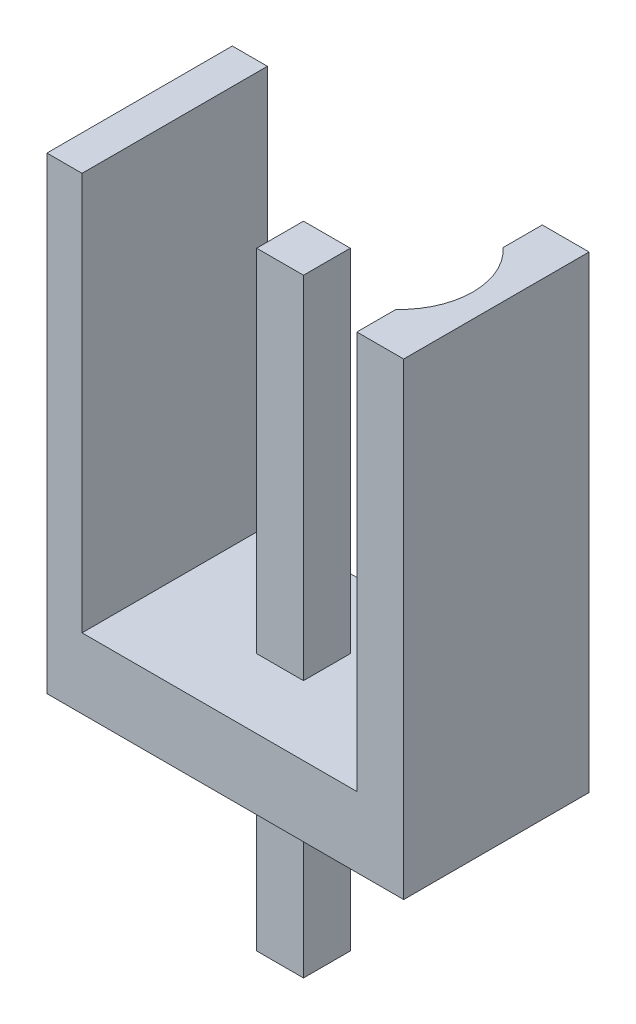
ISO-10303-21;
HEADER;
FILE_DESCRIPTION(('STEP AP214'),'2;1');
FILE_NAME('part.step','',(''),(''),'','','');
FILE_SCHEMA(('AUTOMOTIVE_DESIGN { 1 0 10303 214 1 1 1 1 }'));
ENDSEC;
DATA;
#1=APPLICATION_CONTEXT('core data for automotive mechanical design processes');
#2=APPLICATION_PROTOCOL_DEFINITION('international standard','automotive_design',2000,#1);
#3=PRODUCT_CONTEXT('',#1,'mechanical');
#4=PRODUCT('Part','Part','',(#3));
#5=PRODUCT_RELATED_PRODUCT_CATEGORY('part','',(#4));
#6=PRODUCT_DEFINITION_FORMATION('','',#4);
#7=PRODUCT_DEFINITION_CONTEXT('part definition',#1,'design');
#8=PRODUCT_DEFINITION('design','',#6,#7);
#9=PRODUCT_DEFINITION_SHAPE('','',#8);
#10=(LENGTH_UNIT() NAMED_UNIT(*) SI_UNIT(.MILLI.,.METRE.));
#11=(NAMED_UNIT(*) PLANE_ANGLE_UNIT() SI_UNIT($,.RADIAN.));
#12=(NAMED_UNIT(*) SI_UNIT($,.STERADIAN.) SOLID_ANGLE_UNIT());
#13=UNCERTAINTY_MEASURE_WITH_UNIT(LENGTH_MEASURE(1.E-05),#10,'distance_accuracy_value','');
#14=(GEOMETRIC_REPRESENTATION_CONTEXT(3) GLOBAL_UNCERTAINTY_ASSIGNED_CONTEXT((#13)) GLOBAL_UNIT_ASSIGNED_CONTEXT((#10,
#11,#12)) REPRESENTATION_CONTEXT('',''));
#15=CARTESIAN_POINT('',(0.,0.,0.));
#16=DIRECTION('',(0.,0.,1.));
#17=DIRECTION('',(1.,0.,0.));
#18=AXIS2_PLACEMENT_3D('',#15,#16,#17);
#19=CARTESIAN_POINT('',(-3.81,0.,1.98));
#20=DIRECTION('',(0.,1.,0.));
#21=DIRECTION('',(0.,0.,1.));
#22=AXIS2_PLACEMENT_3D('',#19,#20,#21);
#23=PLANE('',#22);
#24=DIRECTION('',(0.,0.,1.));
#25=VECTOR('',#24,1.);
#26=CARTESIAN_POINT('',(-3.81,0.,-1.98));
#27=LINE('',#26,#25);
#28=CARTESIAN_POINT('',(-3.81,0.,-1.98));
#29=VERTEX_POINT('',#28);
#30=CARTESIAN_POINT('',(-3.81,0.,1.98));
#31=VERTEX_POINT('',#30);
#32=EDGE_CURVE('E253',#29,#31,#27,.T.);
#33=ORIENTED_EDGE('',*,*,#32,.F.);
#34=DIRECTION('',(-1.,0.,0.));
#35=VECTOR('',#34,1.);
#36=CARTESIAN_POINT('',(-3.81,0.,-1.98));
#37=LINE('',#36,#35);
#38=CARTESIAN_POINT('',(3.81,0.,-1.98));
#39=VERTEX_POINT('',#38);
#40=EDGE_CURVE('E260',#39,#29,#37,.T.);
#41=ORIENTED_EDGE('',*,*,#40,.F.);
#42=DIRECTION('',(0.,0.,-1.));
#43=VECTOR('',#42,1.);
#44=CARTESIAN_POINT('',(3.81,0.,-1.98));
#45=LINE('',#44,#43);
#46=CARTESIAN_POINT('',(3.81,0.,1.98));
#47=VERTEX_POINT('',#46);
#48=EDGE_CURVE('E258',#47,#39,#45,.T.);
#49=ORIENTED_EDGE('',*,*,#48,.F.);
#50=DIRECTION('',(1.,0.,0.));
#51=VECTOR('',#50,1.);
#52=CARTESIAN_POINT('',(-3.81,0.,1.98));
#53=LINE('',#52,#51);
#54=EDGE_CURVE('E256',#31,#47,#53,.T.);
#55=ORIENTED_EDGE('',*,*,#54,.F.);
#56=EDGE_LOOP('',(#33,#41,#49,#55));
#57=FACE_BOUND('',#56,.T.);
#58=DIRECTION('',(0.,0.,1.));
#59=VECTOR('',#58,1.);
#60=CARTESIAN_POINT('',(0.19,0.,1.98));
#61=LINE('',#60,#59);
#62=CARTESIAN_POINT('',(0.190000000000002,0.,-0.5));
#63=VERTEX_POINT('',#62);
#64=CARTESIAN_POINT('',(0.190000000000001,0.,0.5));
#65=VERTEX_POINT('',#64);
#66=EDGE_CURVE('E213',#63,#65,#61,.T.);
#67=ORIENTED_EDGE('',*,*,#66,.F.);
#68=DIRECTION('',(1.,0.,0.));
#69=VECTOR('',#68,1.);
#70=CARTESIAN_POINT('',(-3.81,0.,-0.5));
#71=LINE('',#70,#69);
#72=CARTESIAN_POINT('',(-0.809999999999999,0.,-0.5));
#73=VERTEX_POINT('',#72);
#74=EDGE_CURVE('E208',#73,#63,#71,.T.);
#75=ORIENTED_EDGE('',*,*,#74,.F.);
#76=DIRECTION('',(0.,0.,-1.));
#77=VECTOR('',#76,1.);
#78=CARTESIAN_POINT('',(-0.809999999999999,0.,1.98));
#79=LINE('',#78,#77);
#80=CARTESIAN_POINT('',(-0.809999999999999,0.,0.5));
#81=VERTEX_POINT('',#80);
#82=EDGE_CURVE('E54',#81,#73,#79,.T.);
#83=ORIENTED_EDGE('',*,*,#82,.F.);
#84=DIRECTION('',(-1.,0.,0.));
#85=VECTOR('',#84,1.);
#86=CARTESIAN_POINT('',(-3.81,0.,0.5));
#87=LINE('',#86,#85);
#88=EDGE_CURVE('E49',#65,#81,#87,.T.);
#89=ORIENTED_EDGE('',*,*,#88,.F.);
#90=EDGE_LOOP('',(#67,#75,#83,#89));
#91=FACE_BOUND('',#90,.T.);
#92=ADVANCED_FACE('F34',(#57,#91),#23,.F.);
#93=CARTESIAN_POINT('',(-3.81,1.5,1.98));
#94=DIRECTION('',(0.,1.,0.));
#95=DIRECTION('',(0.,0.,1.));
#96=AXIS2_PLACEMENT_3D('',#93,#94,#95);
#97=PLANE('',#96);
#98=DIRECTION('',(-1.,0.,0.));
#99=VECTOR('',#98,1.);
#100=CARTESIAN_POINT('',(2.81,1.5,1.98));
#101=LINE('',#100,#99);
#102=CARTESIAN_POINT('',(2.81,1.5,1.98));
#103=VERTEX_POINT('',#102);
#104=CARTESIAN_POINT('',(-3.06,1.5,1.98));
#105=VERTEX_POINT('',#104);
#106=EDGE_CURVE('E226',#103,#105,#101,.T.);
#107=ORIENTED_EDGE('',*,*,#106,.F.);
#108=DIRECTION('',(0.,0.,1.));
#109=VECTOR('',#108,1.);
#110=CARTESIAN_POINT('',(2.81,1.5,1.144818304361));
#111=LINE('',#110,#109);
#112=CARTESIAN_POINT('',(2.81,1.5,1.144818304361));
#113=VERTEX_POINT('',#112);
#114=EDGE_CURVE('E229',#113,#103,#111,.T.);
#115=ORIENTED_EDGE('',*,*,#114,.F.);
#116=CARTESIAN_POINT('',(1.74939105,1.5,0.));
#117=DIRECTION('',(0.,1.,0.));
#118=DIRECTION('',(0.,0.,1.));
#119=AXIS2_PLACEMENT_3D('',#116,#117,#118);
#120=CIRCLE('',#119,1.56060895);
#121=CARTESIAN_POINT('',(2.81,1.5,-1.144818304361));
#122=VERTEX_POINT('',#121);
#123=EDGE_CURVE('E216',#122,#113,#120,.F.);
#124=ORIENTED_EDGE('',*,*,#123,.F.);
#125=DIRECTION('',(0.,0.,1.));
#126=VECTOR('',#125,1.);
#127=CARTESIAN_POINT('',(2.81,1.5,-1.144818304361));
#128=LINE('',#127,#126);
#129=CARTESIAN_POINT('',(2.81,1.5,-1.98));
#130=VERTEX_POINT('',#129);
#131=EDGE_CURVE('E218',#130,#122,#128,.T.);
#132=ORIENTED_EDGE('',*,*,#131,.F.);
#133=DIRECTION('',(1.,0.,0.));
#134=VECTOR('',#133,1.);
#135=CARTESIAN_POINT('',(2.81,1.5,-1.98));
#136=LINE('',#135,#134);
#137=CARTESIAN_POINT('',(-3.06,1.5,-1.98));
#138=VERTEX_POINT('',#137);
#139=EDGE_CURVE('E221',#138,#130,#136,.T.);
#140=ORIENTED_EDGE('',*,*,#139,.F.);
#141=DIRECTION('',(0.,0.,-1.));
#142=VECTOR('',#141,1.);
#143=CARTESIAN_POINT('',(-3.06,1.5,-1.98));
#144=LINE('',#143,#142);
#145=EDGE_CURVE('E224',#105,#138,#144,.T.);
#146=ORIENTED_EDGE('',*,*,#145,.F.);
#147=EDGE_LOOP('',(#107,#115,#124,#132,#140,#146));
#148=FACE_BOUND('',#147,.T.);
#149=DIRECTION('',(1.,0.,0.));
#150=VECTOR('',#149,1.);
#151=CARTESIAN_POINT('',(-3.81,1.5,-0.5));
#152=LINE('',#151,#150);
#153=CARTESIAN_POINT('',(-0.809999999999999,1.5,-0.5));
#154=VERTEX_POINT('',#153);
#155=CARTESIAN_POINT('',(0.190000000000002,1.5,-0.5));
#156=VERTEX_POINT('',#155);
#157=EDGE_CURVE('E287',#154,#156,#152,.T.);
#158=ORIENTED_EDGE('',*,*,#157,.T.);
#159=DIRECTION('',(0.,0.,1.));
#160=VECTOR('',#159,1.);
#161=CARTESIAN_POINT('',(0.19,1.5,1.98));
#162=LINE('',#161,#160);
#163=CARTESIAN_POINT('',(0.190000000000001,1.5,0.5));
#164=VERTEX_POINT('',#163);
#165=EDGE_CURVE('E12',#156,#164,#162,.T.);
#166=ORIENTED_EDGE('',*,*,#165,.T.);
#167=DIRECTION('',(-1.,0.,0.));
#168=VECTOR('',#167,1.);
#169=CARTESIAN_POINT('',(-3.81,1.5,0.5));
#170=LINE('',#169,#168);
#171=CARTESIAN_POINT('',(-0.809999999999999,1.5,0.5));
#172=VERTEX_POINT('',#171);
#173=EDGE_CURVE('E42',#164,#172,#170,.T.);
#174=ORIENTED_EDGE('',*,*,#173,.T.);
#175=DIRECTION('',(0.,0.,-1.));
#176=VECTOR('',#175,1.);
#177=CARTESIAN_POINT('',(-0.809999999999999,1.5,1.98));
#178=LINE('',#177,#176);
#179=EDGE_CURVE('E163',#172,#154,#178,.T.);
#180=ORIENTED_EDGE('',*,*,#179,.T.);
#181=EDGE_LOOP('',(#158,#166,#174,#180));
#182=FACE_BOUND('',#181,.T.);
#183=ADVANCED_FACE('F291',(#148,#182),#97,.T.);
#184=CARTESIAN_POINT('',(-3.81,10.,1.98));
#185=DIRECTION('',(0.,1.,0.));
#186=DIRECTION('',(0.,0.,1.));
#187=AXIS2_PLACEMENT_3D('',#184,#185,#186);
#188=PLANE('',#187);
#189=DIRECTION('',(0.,0.,1.));
#190=VECTOR('',#189,1.);
#191=CARTESIAN_POINT('',(-3.06,10.,-1.98));
#192=LINE('',#191,#190);
#193=CARTESIAN_POINT('',(-3.06,10.,-1.98));
#194=VERTEX_POINT('',#193);
#195=CARTESIAN_POINT('',(-3.06,10.,1.98));
#196=VERTEX_POINT('',#195);
#197=EDGE_CURVE('E237',#194,#196,#192,.T.);
#198=ORIENTED_EDGE('',*,*,#197,.F.);
#199=DIRECTION('',(-1.,0.,0.));
#200=VECTOR('',#199,1.);
#201=CARTESIAN_POINT('',(-3.81,10.,-1.98));
#202=LINE('',#201,#200);
#203=CARTESIAN_POINT('',(-3.81,10.,-1.98));
#204=VERTEX_POINT('',#203);
#205=EDGE_CURVE('E271',#194,#204,#202,.T.);
#206=ORIENTED_EDGE('',*,*,#205,.T.);
#207=DIRECTION('',(0.,0.,1.));
#208=VECTOR('',#207,1.);
#209=CARTESIAN_POINT('',(-3.81,10.,-1.98));
#210=LINE('',#209,#208);
#211=CARTESIAN_POINT('',(-3.81,10.,1.98));
#212=VERTEX_POINT('',#211);
#213=EDGE_CURVE('E262',#204,#212,#210,.T.);
#214=ORIENTED_EDGE('',*,*,#213,.T.);
#215=DIRECTION('',(1.,0.,0.));
#216=VECTOR('',#215,1.);
#217=CARTESIAN_POINT('',(-3.81,10.,1.98));
#218=LINE('',#217,#216);
#219=EDGE_CURVE('E266',#212,#196,#218,.T.);
#220=ORIENTED_EDGE('',*,*,#219,.T.);
#221=EDGE_LOOP('',(#198,#206,#214,#220));
#222=FACE_BOUND('',#221,.T.);
#223=ADVANCED_FACE('F318',(#222),#188,.T.);
#224=CARTESIAN_POINT('',(-3.81,10.,-1.98));
#225=DIRECTION('',(1.,0.,0.));
#226=DIRECTION('',(0.,0.,-1.));
#227=AXIS2_PLACEMENT_3D('',#224,#225,#226);
#228=PLANE('',#227);
#229=ORIENTED_EDGE('',*,*,#32,.T.);
#230=DIRECTION('',(0.,-1.,0.));
#231=VECTOR('',#230,1.);
#232=CARTESIAN_POINT('',(-3.81,10.,1.98));
#233=LINE('',#232,#231);
#234=EDGE_CURVE('E284',#212,#31,#233,.T.);
#235=ORIENTED_EDGE('',*,*,#234,.F.);
#236=ORIENTED_EDGE('',*,*,#213,.F.);
#237=DIRECTION('',(0.,-1.,0.));
#238=VECTOR('',#237,1.);
#239=CARTESIAN_POINT('',(-3.81,10.,-1.98));
#240=LINE('',#239,#238);
#241=EDGE_CURVE('E275',#204,#29,#240,.T.);
#242=ORIENTED_EDGE('',*,*,#241,.T.);
#243=EDGE_LOOP('',(#229,#235,#236,#242));
#244=FACE_BOUND('',#243,.T.);
#245=ADVANCED_FACE('F36',(#244),#228,.F.);
#246=CARTESIAN_POINT('',(-3.81,10.,1.98));
#247=DIRECTION('',(0.,0.,-1.));
#248=DIRECTION('',(-1.,0.,0.));
#249=AXIS2_PLACEMENT_3D('',#246,#247,#248);
#250=PLANE('',#249);
#251=ORIENTED_EDGE('',*,*,#106,.T.);
#252=DIRECTION('',(0.,1.,0.));
#253=VECTOR('',#252,1.);
#254=CARTESIAN_POINT('',(-3.06,-7.50056664526088,1.98));
#255=LINE('',#254,#253);
#256=EDGE_CURVE('E219',#105,#196,#255,.T.);
#257=ORIENTED_EDGE('',*,*,#256,.T.);
#258=ORIENTED_EDGE('',*,*,#219,.F.);
#259=ORIENTED_EDGE('',*,*,#234,.T.);
#260=ORIENTED_EDGE('',*,*,#54,.T.);
#261=DIRECTION('',(0.,-1.,0.));
#262=VECTOR('',#261,1.);
#263=CARTESIAN_POINT('',(3.81,10.,1.98));
#264=LINE('',#263,#262);
#265=CARTESIAN_POINT('',(3.81,10.,1.98));
#266=VERTEX_POINT('',#265);
#267=EDGE_CURVE('E281',#266,#47,#264,.T.);
#268=ORIENTED_EDGE('',*,*,#267,.F.);
#269=CARTESIAN_POINT('',(2.81,10.,1.98));
#270=VERTEX_POINT('',#269);
#271=EDGE_CURVE('E265',#270,#266,#218,.T.);
#272=ORIENTED_EDGE('',*,*,#271,.F.);
#273=DIRECTION('',(0.,1.,0.));
#274=VECTOR('',#273,1.);
#275=CARTESIAN_POINT('',(2.81,-7.50056664526088,1.98));
#276=LINE('',#275,#274);
#277=EDGE_CURVE('E239',#103,#270,#276,.T.);
#278=ORIENTED_EDGE('',*,*,#277,.F.);
#279=EDGE_LOOP('',(#251,#257,#258,#259,#260,#268,#272,#278));
#280=FACE_BOUND('',#279,.T.);
#281=ADVANCED_FACE('F336',(#280),#250,.F.);
#282=CARTESIAN_POINT('',(3.81,10.,-1.98));
#283=DIRECTION('',(-1.,0.,0.));
#284=DIRECTION('',(0.,0.,1.));
#285=AXIS2_PLACEMENT_3D('',#282,#283,#284);
#286=PLANE('',#285);
#287=ORIENTED_EDGE('',*,*,#48,.T.);
#288=DIRECTION('',(0.,-1.,0.));
#289=VECTOR('',#288,1.);
#290=CARTESIAN_POINT('',(3.81,10.,-1.98));
#291=LINE('',#290,#289);
#292=CARTESIAN_POINT('',(3.81,10.,-1.98));
#293=VERTEX_POINT('',#292);
#294=EDGE_CURVE('E278',#293,#39,#291,.T.);
#295=ORIENTED_EDGE('',*,*,#294,.F.);
#296=DIRECTION('',(0.,0.,-1.));
#297=VECTOR('',#296,1.);
#298=CARTESIAN_POINT('',(3.81,10.,-1.98));
#299=LINE('',#298,#297);
#300=EDGE_CURVE('E269',#266,#293,#299,.T.);
#301=ORIENTED_EDGE('',*,*,#300,.F.);
#302=ORIENTED_EDGE('',*,*,#267,.T.);
#303=EDGE_LOOP('',(#287,#295,#301,#302));
#304=FACE_BOUND('',#303,.T.);
#305=ADVANCED_FACE('F333',(#304),#286,.F.);
#306=CARTESIAN_POINT('',(-3.81,10.,-1.98));
#307=DIRECTION('',(0.,0.,1.));
#308=DIRECTION('',(1.,0.,0.));
#309=AXIS2_PLACEMENT_3D('',#306,#307,#308);
#310=PLANE('',#309);
#311=ORIENTED_EDGE('',*,*,#205,.F.);
#312=DIRECTION('',(0.,1.,0.));
#313=VECTOR('',#312,1.);
#314=CARTESIAN_POINT('',(-3.06,-7.50056664526088,-1.98));
#315=LINE('',#314,#313);
#316=EDGE_CURVE('E242',#138,#194,#315,.T.);
#317=ORIENTED_EDGE('',*,*,#316,.F.);
#318=ORIENTED_EDGE('',*,*,#139,.T.);
#319=DIRECTION('',(0.,1.,0.));
#320=VECTOR('',#319,1.);
#321=CARTESIAN_POINT('',(2.81,-7.50056664526088,-1.98));
#322=LINE('',#321,#320);
#323=CARTESIAN_POINT('',(2.81,10.,-1.98));
#324=VERTEX_POINT('',#323);
#325=EDGE_CURVE('E244',#130,#324,#322,.T.);
#326=ORIENTED_EDGE('',*,*,#325,.T.);
#327=EDGE_CURVE('E272',#293,#324,#202,.T.);
#328=ORIENTED_EDGE('',*,*,#327,.F.);
#329=ORIENTED_EDGE('',*,*,#294,.T.);
#330=ORIENTED_EDGE('',*,*,#40,.T.);
#331=ORIENTED_EDGE('',*,*,#241,.F.);
#332=EDGE_LOOP('',(#311,#317,#318,#326,#328,#329,#330,#331));
#333=FACE_BOUND('',#332,.T.);
#334=ADVANCED_FACE('F329',(#333),#310,.F.);
#335=DIRECTION('',(0.,0.,-1.));
#336=VECTOR('',#335,1.);
#337=CARTESIAN_POINT('',(2.81,10.,-1.144818304361));
#338=LINE('',#337,#336);
#339=CARTESIAN_POINT('',(2.81,10.,-1.144818304361));
#340=VERTEX_POINT('',#339);
#341=EDGE_CURVE('E235',#340,#324,#338,.T.);
#342=ORIENTED_EDGE('',*,*,#341,.F.);
#343=CARTESIAN_POINT('',(1.74939105,10.,0.));
#344=DIRECTION('',(0.,1.,0.));
#345=DIRECTION('',(0.,0.,1.));
#346=AXIS2_PLACEMENT_3D('',#343,#344,#345);
#347=CIRCLE('',#346,1.56060895);
#348=CARTESIAN_POINT('',(2.81,10.,1.144818304361));
#349=VERTEX_POINT('',#348);
#350=EDGE_CURVE('E232',#349,#340,#347,.T.);
#351=ORIENTED_EDGE('',*,*,#350,.F.);
#352=DIRECTION('',(0.,0.,-1.));
#353=VECTOR('',#352,1.);
#354=CARTESIAN_POINT('',(2.81,10.,1.144818304361));
#355=LINE('',#354,#353);
#356=EDGE_CURVE('E215',#270,#349,#355,.T.);
#357=ORIENTED_EDGE('',*,*,#356,.F.);
#358=ORIENTED_EDGE('',*,*,#271,.T.);
#359=ORIENTED_EDGE('',*,*,#300,.T.);
#360=ORIENTED_EDGE('',*,*,#327,.T.);
#361=EDGE_LOOP('',(#342,#351,#357,#358,#359,#360));
#362=FACE_BOUND('',#361,.T.);
#363=ADVANCED_FACE('F325',(#362),#188,.T.);
#364=CARTESIAN_POINT('',(-3.06,-7.50056664526088,-1.98));
#365=DIRECTION('',(-1.,0.,0.));
#366=DIRECTION('',(0.,0.,1.));
#367=AXIS2_PLACEMENT_3D('',#364,#365,#366);
#368=PLANE('',#367);
#369=ORIENTED_EDGE('',*,*,#145,.T.);
#370=ORIENTED_EDGE('',*,*,#316,.T.);
#371=ORIENTED_EDGE('',*,*,#197,.T.);
#372=ORIENTED_EDGE('',*,*,#256,.F.);
#373=EDGE_LOOP('',(#369,#370,#371,#372));
#374=FACE_BOUND('',#373,.T.);
#375=ADVANCED_FACE('F328',(#374),#368,.F.);
#376=CARTESIAN_POINT('',(2.81,-7.50056664526088,-1.144818304361));
#377=DIRECTION('',(1.,0.,0.));
#378=DIRECTION('',(0.,0.,-1.));
#379=AXIS2_PLACEMENT_3D('',#376,#377,#378);
#380=PLANE('',#379);
#381=ORIENTED_EDGE('',*,*,#131,.T.);
#382=DIRECTION('',(0.,1.,0.));
#383=VECTOR('',#382,1.);
#384=CARTESIAN_POINT('',(2.81,-7.50056664526088,-1.144818304361));
#385=LINE('',#384,#383);
#386=EDGE_CURVE('E247',#122,#340,#385,.T.);
#387=ORIENTED_EDGE('',*,*,#386,.T.);
#388=ORIENTED_EDGE('',*,*,#341,.T.);
#389=ORIENTED_EDGE('',*,*,#325,.F.);
#390=EDGE_LOOP('',(#381,#387,#388,#389));
#391=FACE_BOUND('',#390,.T.);
#392=ADVANCED_FACE('F375',(#391),#380,.F.);
#393=CARTESIAN_POINT('',(1.74939105,-7.50056664526088,0.));
#394=DIRECTION('',(0.,1.,0.));
#395=DIRECTION('',(0.,0.,1.));
#396=AXIS2_PLACEMENT_3D('',#393,#394,#395);
#397=CYLINDRICAL_SURFACE('',#396,1.56060895);
#398=ORIENTED_EDGE('',*,*,#123,.T.);
#399=DIRECTION('',(0.,1.,0.));
#400=VECTOR('',#399,1.);
#401=CARTESIAN_POINT('',(2.81,-7.50056664526088,1.144818304361));
#402=LINE('',#401,#400);
#403=EDGE_CURVE('E249',#113,#349,#402,.T.);
#404=ORIENTED_EDGE('',*,*,#403,.T.);
#405=ORIENTED_EDGE('',*,*,#350,.T.);
#406=ORIENTED_EDGE('',*,*,#386,.F.);
#407=EDGE_LOOP('',(#398,#404,#405,#406));
#408=FACE_BOUND('',#407,.T.);
#409=ADVANCED_FACE('F371',(#408),#397,.F.);
#410=CARTESIAN_POINT('',(2.81,-7.50056664526088,1.144818304361));
#411=DIRECTION('',(1.,0.,0.));
#412=DIRECTION('',(0.,0.,-1.));
#413=AXIS2_PLACEMENT_3D('',#410,#411,#412);
#414=PLANE('',#413);
#415=ORIENTED_EDGE('',*,*,#114,.T.);
#416=ORIENTED_EDGE('',*,*,#277,.T.);
#417=ORIENTED_EDGE('',*,*,#356,.T.);
#418=ORIENTED_EDGE('',*,*,#403,.F.);
#419=EDGE_LOOP('',(#415,#416,#417,#418));
#420=FACE_BOUND('',#419,.T.);
#421=ADVANCED_FACE('F306',(#420),#414,.F.);
#422=CARTESIAN_POINT('',(-3.81,9.,1.98));
#423=DIRECTION('',(0.,1.,0.));
#424=DIRECTION('',(0.,0.,1.));
#425=AXIS2_PLACEMENT_3D('',#422,#423,#424);
#426=PLANE('',#425);
#427=DIRECTION('',(0.,0.,1.));
#428=VECTOR('',#427,1.);
#429=CARTESIAN_POINT('',(0.190000000000001,9.,0.5));
#430=LINE('',#429,#428);
#431=CARTESIAN_POINT('',(0.190000000000002,9.,-0.5));
#432=VERTEX_POINT('',#431);
#433=CARTESIAN_POINT('',(0.190000000000001,9.,0.5));
#434=VERTEX_POINT('',#433);
#435=EDGE_CURVE('E185',#432,#434,#430,.T.);
#436=ORIENTED_EDGE('',*,*,#435,.F.);
#437=DIRECTION('',(1.,0.,0.));
#438=VECTOR('',#437,1.);
#439=CARTESIAN_POINT('',(0.190000000000002,9.,-0.5));
#440=LINE('',#439,#438);
#441=CARTESIAN_POINT('',(-0.809999999999999,9.,-0.5));
#442=VERTEX_POINT('',#441);
#443=EDGE_CURVE('E178',#442,#432,#440,.T.);
#444=ORIENTED_EDGE('',*,*,#443,.F.);
#445=DIRECTION('',(0.,0.,-1.));
#446=VECTOR('',#445,1.);
#447=CARTESIAN_POINT('',(-0.809999999999999,9.,0.5));
#448=LINE('',#447,#446);
#449=CARTESIAN_POINT('',(-0.809999999999999,9.,0.5));
#450=VERTEX_POINT('',#449);
#451=EDGE_CURVE('E161',#450,#442,#448,.T.);
#452=ORIENTED_EDGE('',*,*,#451,.F.);
#453=DIRECTION('',(-1.,0.,0.));
#454=VECTOR('',#453,1.);
#455=CARTESIAN_POINT('',(0.190000000000001,9.,0.5));
#456=LINE('',#455,#454);
#457=EDGE_CURVE('E175',#434,#450,#456,.T.);
#458=ORIENTED_EDGE('',*,*,#457,.F.);
#459=EDGE_LOOP('',(#436,#444,#452,#458));
#460=FACE_BOUND('',#459,.T.);
#461=ADVANCED_FACE('F174',(#460),#426,.T.);
#462=CARTESIAN_POINT('',(0.190000000000002,-4.,-0.5));
#463=DIRECTION('',(0.,0.,1.));
#464=DIRECTION('',(1.,0.,0.));
#465=AXIS2_PLACEMENT_3D('',#462,#463,#464);
#466=PLANE('',#465);
#467=ORIENTED_EDGE('',*,*,#157,.F.);
#468=DIRECTION('',(0.,1.,0.));
#469=VECTOR('',#468,1.);
#470=CARTESIAN_POINT('',(-0.809999999999999,-4.,-0.5));
#471=LINE('',#470,#469);
#472=EDGE_CURVE('E201',#154,#442,#471,.T.);
#473=ORIENTED_EDGE('',*,*,#472,.T.);
#474=ORIENTED_EDGE('',*,*,#443,.T.);
#475=DIRECTION('',(0.,1.,0.));
#476=VECTOR('',#475,1.);
#477=CARTESIAN_POINT('',(0.190000000000002,-4.,-0.5));
#478=LINE('',#477,#476);
#479=EDGE_CURVE('E197',#156,#432,#478,.T.);
#480=ORIENTED_EDGE('',*,*,#479,.F.);
#481=EDGE_LOOP('',(#467,#473,#474,#480));
#482=FACE_BOUND('',#481,.T.);
#483=ADVANCED_FACE('F296',(#482),#466,.F.);
#484=CARTESIAN_POINT('',(-0.809999999999999,-4.,0.5));
#485=DIRECTION('',(1.,0.,0.));
#486=DIRECTION('',(0.,0.,-1.));
#487=AXIS2_PLACEMENT_3D('',#484,#485,#486);
#488=PLANE('',#487);
#489=ORIENTED_EDGE('',*,*,#179,.F.);
#490=DIRECTION('',(0.,1.,0.));
#491=VECTOR('',#490,1.);
#492=CARTESIAN_POINT('',(-0.809999999999999,-4.,0.5));
#493=LINE('',#492,#491);
#494=EDGE_CURVE('E157',#172,#450,#493,.T.);
#495=ORIENTED_EDGE('',*,*,#494,.T.);
#496=ORIENTED_EDGE('',*,*,#451,.T.);
#497=ORIENTED_EDGE('',*,*,#472,.F.);
#498=EDGE_LOOP('',(#489,#495,#496,#497));
#499=FACE_BOUND('',#498,.T.);
#500=ADVANCED_FACE('F159',(#499),#488,.F.);
#501=CARTESIAN_POINT('',(0.190000000000001,-4.,0.5));
#502=DIRECTION('',(0.,0.,-1.));
#503=DIRECTION('',(-1.,0.,0.));
#504=AXIS2_PLACEMENT_3D('',#501,#502,#503);
#505=PLANE('',#504);
#506=ORIENTED_EDGE('',*,*,#173,.F.);
#507=DIRECTION('',(0.,1.,0.));
#508=VECTOR('',#507,1.);
#509=CARTESIAN_POINT('',(0.190000000000001,-4.,0.5));
#510=LINE('',#509,#508);
#511=EDGE_CURVE('E182',#164,#434,#510,.T.);
#512=ORIENTED_EDGE('',*,*,#511,.T.);
#513=ORIENTED_EDGE('',*,*,#457,.T.);
#514=ORIENTED_EDGE('',*,*,#494,.F.);
#515=EDGE_LOOP('',(#506,#512,#513,#514));
#516=FACE_BOUND('',#515,.T.);
#517=ADVANCED_FACE('F180',(#516),#505,.F.);
#518=CARTESIAN_POINT('',(0.190000000000001,-4.,0.5));
#519=DIRECTION('',(-1.,0.,0.));
#520=DIRECTION('',(0.,0.,1.));
#521=AXIS2_PLACEMENT_3D('',#518,#519,#520);
#522=PLANE('',#521);
#523=ORIENTED_EDGE('',*,*,#165,.F.);
#524=ORIENTED_EDGE('',*,*,#479,.T.);
#525=ORIENTED_EDGE('',*,*,#435,.T.);
#526=ORIENTED_EDGE('',*,*,#511,.F.);
#527=EDGE_LOOP('',(#523,#524,#525,#526));
#528=FACE_BOUND('',#527,.T.);
#529=ADVANCED_FACE('F294',(#528),#522,.F.);
#530=CARTESIAN_POINT('',(0.190000000000002,-4.,-0.5));
#531=VERTEX_POINT('',#530);
#532=EDGE_CURVE('E198',#531,#63,#478,.T.);
#533=ORIENTED_EDGE('',*,*,#532,.T.);
#534=ORIENTED_EDGE('',*,*,#66,.T.);
#535=CARTESIAN_POINT('',(0.190000000000001,-4.,0.5));
#536=VERTEX_POINT('',#535);
#537=EDGE_CURVE('E205',#536,#65,#510,.T.);
#538=ORIENTED_EDGE('',*,*,#537,.F.);
#539=DIRECTION('',(0.,0.,1.));
#540=VECTOR('',#539,1.);
#541=CARTESIAN_POINT('',(0.190000000000001,-4.,0.5));
#542=LINE('',#541,#540);
#543=EDGE_CURVE('E187',#531,#536,#542,.T.);
#544=ORIENTED_EDGE('',*,*,#543,.F.);
#545=EDGE_LOOP('',(#533,#534,#538,#544));
#546=FACE_BOUND('',#545,.T.);
#547=ADVANCED_FACE('F386',(#546),#522,.F.);
#548=ORIENTED_EDGE('',*,*,#537,.T.);
#549=ORIENTED_EDGE('',*,*,#88,.T.);
#550=CARTESIAN_POINT('',(-0.809999999999999,-4.,0.5));
#551=VERTEX_POINT('',#550);
#552=EDGE_CURVE('E167',#551,#81,#493,.T.);
#553=ORIENTED_EDGE('',*,*,#552,.F.);
#554=DIRECTION('',(-1.,0.,0.));
#555=VECTOR('',#554,1.);
#556=CARTESIAN_POINT('',(0.190000000000001,-4.,0.5));
#557=LINE('',#556,#555);
#558=EDGE_CURVE('E191',#536,#551,#557,.T.);
#559=ORIENTED_EDGE('',*,*,#558,.F.);
#560=EDGE_LOOP('',(#548,#549,#553,#559));
#561=FACE_BOUND('',#560,.T.);
#562=ADVANCED_FACE('F388',(#561),#505,.F.);
#563=ORIENTED_EDGE('',*,*,#552,.T.);
#564=ORIENTED_EDGE('',*,*,#82,.T.);
#565=CARTESIAN_POINT('',(-0.809999999999999,-4.,-0.5));
#566=VERTEX_POINT('',#565);
#567=EDGE_CURVE('E168',#566,#73,#471,.T.);
#568=ORIENTED_EDGE('',*,*,#567,.F.);
#569=DIRECTION('',(0.,0.,-1.));
#570=VECTOR('',#569,1.);
#571=CARTESIAN_POINT('',(-0.809999999999999,-4.,0.5));
#572=LINE('',#571,#570);
#573=EDGE_CURVE('E193',#551,#566,#572,.T.);
#574=ORIENTED_EDGE('',*,*,#573,.F.);
#575=EDGE_LOOP('',(#563,#564,#568,#574));
#576=FACE_BOUND('',#575,.T.);
#577=ADVANCED_FACE('F305',(#576),#488,.F.);
#578=ORIENTED_EDGE('',*,*,#567,.T.);
#579=ORIENTED_EDGE('',*,*,#74,.T.);
#580=ORIENTED_EDGE('',*,*,#532,.F.);
#581=DIRECTION('',(1.,0.,0.));
#582=VECTOR('',#581,1.);
#583=CARTESIAN_POINT('',(0.190000000000002,-4.,-0.5));
#584=LINE('',#583,#582);
#585=EDGE_CURVE('E195',#566,#531,#584,.T.);
#586=ORIENTED_EDGE('',*,*,#585,.F.);
#587=EDGE_LOOP('',(#578,#579,#580,#586));
#588=FACE_BOUND('',#587,.T.);
#589=ADVANCED_FACE('F299',(#588),#466,.F.);
#590=CARTESIAN_POINT('',(0.190000000000002,-4.,-0.5));
#591=DIRECTION('',(0.,1.,0.));
#592=DIRECTION('',(0.,0.,1.));
#593=AXIS2_PLACEMENT_3D('',#590,#591,#592);
#594=PLANE('',#593);
#595=ORIENTED_EDGE('',*,*,#543,.T.);
#596=ORIENTED_EDGE('',*,*,#558,.T.);
#597=ORIENTED_EDGE('',*,*,#573,.T.);
#598=ORIENTED_EDGE('',*,*,#585,.T.);
#599=EDGE_LOOP('',(#595,#596,#597,#598));
#600=FACE_BOUND('',#599,.T.);
#601=ADVANCED_FACE('F310',(#600),#594,.F.);
#602=CLOSED_SHELL('',(#92,#183,#223,#245,#281,#305,#334,#363,#375,#392,#409,#421,#461,#483,#500,
#517,#529,#547,#562,#577,#589,#601));
#603=MANIFOLD_SOLID_BREP('B2',#602);
#604=ADVANCED_BREP_SHAPE_REPRESENTATION('',(#18,#603),#14);
#605=SHAPE_DEFINITION_REPRESENTATION(#9,#604);
ENDSEC;
END-ISO-10303-21;
